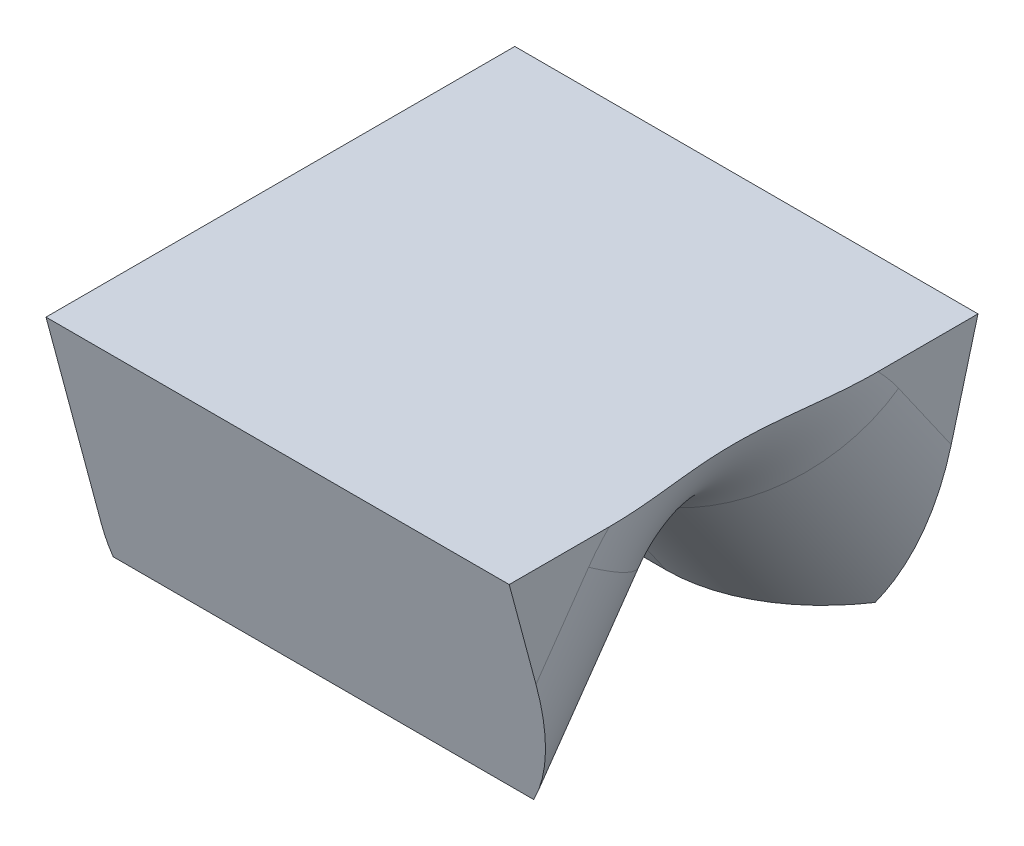
ISO-10303-21;
HEADER;
FILE_DESCRIPTION(('STEP AP214'),'2;1');
FILE_NAME('part.step','',(''),(''),'','','');
FILE_SCHEMA(('AUTOMOTIVE_DESIGN { 1 0 10303 214 1 1 1 1 }'));
ENDSEC;
DATA;
#1=APPLICATION_CONTEXT('core data for automotive mechanical design processes');
#2=APPLICATION_PROTOCOL_DEFINITION('international standard','automotive_design',2000,#1);
#3=PRODUCT_CONTEXT('',#1,'mechanical');
#4=PRODUCT('Part','Part','',(#3));
#5=PRODUCT_RELATED_PRODUCT_CATEGORY('part','',(#4));
#6=PRODUCT_DEFINITION_FORMATION('','',#4);
#7=PRODUCT_DEFINITION_CONTEXT('part definition',#1,'design');
#8=PRODUCT_DEFINITION('design','',#6,#7);
#9=PRODUCT_DEFINITION_SHAPE('','',#8);
#10=(LENGTH_UNIT() NAMED_UNIT(*) SI_UNIT(.MILLI.,.METRE.));
#11=(NAMED_UNIT(*) PLANE_ANGLE_UNIT() SI_UNIT($,.RADIAN.));
#12=(NAMED_UNIT(*) SI_UNIT($,.STERADIAN.) SOLID_ANGLE_UNIT());
#13=UNCERTAINTY_MEASURE_WITH_UNIT(LENGTH_MEASURE(1.E-05),#10,'distance_accuracy_value','');
#14=(GEOMETRIC_REPRESENTATION_CONTEXT(3) GLOBAL_UNCERTAINTY_ASSIGNED_CONTEXT((#13)) GLOBAL_UNIT_ASSIGNED_CONTEXT((#10,
#11,#12)) REPRESENTATION_CONTEXT('',''));
#15=CARTESIAN_POINT('',(0.,0.,0.));
#16=DIRECTION('',(0.,0.,1.));
#17=DIRECTION('',(1.,0.,0.));
#18=AXIS2_PLACEMENT_3D('',#15,#16,#17);
#19=CARTESIAN_POINT('',(0.,0.277595628415304,0.));
#20=DIRECTION('',(0.,1.,0.));
#21=DIRECTION('',(0.,0.,1.));
#22=AXIS2_PLACEMENT_3D('',#19,#20,#21);
#23=PLANE('',#22);
#24=DIRECTION('',(0.,0.,-1.));
#25=VECTOR('',#24,1.);
#26=CARTESIAN_POINT('',(-0.26924,0.277595628415304,1.50859998));
#27=LINE('',#26,#25);
#28=CARTESIAN_POINT('',(-0.269239999999999,0.277595628415304,0.273771524456291));
#29=VERTEX_POINT('',#28);
#30=CARTESIAN_POINT('',(-0.269239999999999,0.277595628415304,-0.273771524456291));
#31=VERTEX_POINT('',#30);
#32=EDGE_CURVE('E328',#29,#31,#27,.T.);
#33=ORIENTED_EDGE('',*,*,#32,.F.);
#34=DIRECTION('',(-1.,0.,0.));
#35=VECTOR('',#34,1.);
#36=CARTESIAN_POINT('',(1.50859998,0.277595628415304,0.273771524456291));
#37=LINE('',#36,#35);
#38=CARTESIAN_POINT('',(0.27178,0.277595628415304,0.273771524456291));
#39=VERTEX_POINT('',#38);
#40=EDGE_CURVE('E154',#39,#29,#37,.T.);
#41=ORIENTED_EDGE('',*,*,#40,.F.);
#42=DIRECTION('',(0.,0.,1.));
#43=VECTOR('',#42,1.);
#44=CARTESIAN_POINT('',(0.27178,0.277595628415304,1.50859998));
#45=LINE('',#44,#43);
#46=CARTESIAN_POINT('',(0.27178,0.277595628415304,0.156835133555911));
#47=VERTEX_POINT('',#46);
#48=EDGE_CURVE('E63',#47,#39,#45,.T.);
#49=ORIENTED_EDGE('',*,*,#48,.F.);
#50=CARTESIAN_POINT('',(0.260856065764861,0.277595628415304,0.));
#51=CARTESIAN_POINT('',(0.260859581723212,0.277595628415304,0.0133573572333045));
#52=CARTESIAN_POINT('',(0.261486636752462,0.277595628415304,0.026714564460264));
#53=CARTESIAN_POINT('',(0.263564215693477,0.277595628415304,0.0533773420007175));
#54=CARTESIAN_POINT('',(0.265016467960462,0.277595628415304,0.0666827447303772));
#55=CARTESIAN_POINT('',(0.267877387801581,0.277595628415304,0.0933045480556776));
#56=CARTESIAN_POINT('',(0.269286036769228,0.277595628415304,0.106620950923157));
#57=CARTESIAN_POINT('',(0.271284557554122,0.277595628415304,0.133300755183635));
#58=CARTESIAN_POINT('',(0.271876125746059,0.277595628415304,0.146664001281597));
#59=CARTESIAN_POINT('',(0.271650185577998,0.277595628415304,0.174352881249858));
#60=CARTESIAN_POINT('',(0.270729160155607,0.277595628415304,0.188679171880719));
#61=CARTESIAN_POINT('',(0.266773190056462,0.277595628415304,0.217049988659772));
#62=CARTESIAN_POINT('',(0.263739587941552,0.277595628415304,0.231094687933217));
#63=CARTESIAN_POINT('',(0.255219347439575,0.277595628415304,0.258619114772984));
#64=CARTESIAN_POINT('',(0.249704598402838,0.277595628415304,0.272090375012309));
#65=CARTESIAN_POINT('',(0.236138927454607,0.277595628415304,0.29770338378269));
#66=CARTESIAN_POINT('',(0.228089335107096,0.277595628415304,0.309845824810772));
#67=CARTESIAN_POINT('',(0.210834763642126,0.277595628415304,0.330712750197026));
#68=CARTESIAN_POINT('',(0.201918970562116,0.277595628415304,0.339676587957936));
#69=CARTESIAN_POINT('',(0.182543705320509,0.277595628415304,0.355744079806716));
#70=CARTESIAN_POINT('',(0.172085310358428,0.277595628415304,0.362849022435234));
#71=CARTESIAN_POINT('',(0.151235189983468,0.277595628415304,0.37419383571117));
#72=CARTESIAN_POINT('',(0.140969705379889,0.277595628415304,0.378666863124576));
#73=CARTESIAN_POINT('',(0.119811203993574,0.277595628415304,0.385729341936798));
#74=CARTESIAN_POINT('',(0.108918460966107,0.277595628415304,0.388319608407823));
#75=CARTESIAN_POINT('',(0.0873672233601213,0.277595628415304,0.391443006274816));
#76=CARTESIAN_POINT('',(0.0767218238760435,0.277595628415304,0.392067199115077));
#77=CARTESIAN_POINT('',(0.0554795294128855,0.277595628415304,0.391495039694482));
#78=CARTESIAN_POINT('',(0.0448826338463163,0.277595628415304,0.39029870954299));
#79=CARTESIAN_POINT('',(0.0241739993252354,0.277595628415304,0.386153317625145));
#80=CARTESIAN_POINT('',(0.014057904735605,0.277595628415304,0.383225927400932));
#81=CARTESIAN_POINT('',(-0.00554537216412168,0.277595628415304,0.375737330565397));
#82=CARTESIAN_POINT('',(-0.0150327410201281,0.277595628415304,0.371176611165897));
#83=CARTESIAN_POINT('',(-0.0332587998024882,0.277595628415304,0.360500672800452));
#84=CARTESIAN_POINT('',(-0.0419857056099512,0.277595628415304,0.354365373572935));
#85=CARTESIAN_POINT('',(-0.0583446093571725,0.277595628415304,0.340766624520734));
#86=CARTESIAN_POINT('',(-0.0659755283507225,0.277595628415304,0.333301881894461));
#87=CARTESIAN_POINT('',(-0.0802853842906157,0.277595628415304,0.316930985979422));
#88=CARTESIAN_POINT('',(-0.0869088422774418,0.277595628415304,0.307976439341334));
#89=CARTESIAN_POINT('',(-0.0986806404521546,0.277595628415304,0.289174582103424));
#90=CARTESIAN_POINT('',(-0.103831479314435,0.277595628415304,0.279328821510868));
#91=CARTESIAN_POINT('',(-0.113041341272987,0.277595628415304,0.258113385825763));
#92=CARTESIAN_POINT('',(-0.116966541384629,0.277595628415304,0.246685638348774));
#93=CARTESIAN_POINT('',(-0.121612471693822,0.277595628415304,0.229210331485362));
#94=CARTESIAN_POINT('',(-0.122955483126774,0.277595628415304,0.223318241614892));
#95=CARTESIAN_POINT('',(-0.125244886373686,0.277595628415304,0.211470727028606));
#96=CARTESIAN_POINT('',(-0.126192153740701,0.277595628415304,0.205515472338883));
#97=CARTESIAN_POINT('',(-0.128601922339676,0.277595628415304,0.186646550189418));
#98=CARTESIAN_POINT('',(-0.129394583532181,0.277595628415304,0.173645482962802));
#99=CARTESIAN_POINT('',(-0.129648706517757,0.277595628415304,0.147627773005509));
#100=CARTESIAN_POINT('',(-0.129107771661843,0.277595628415304,0.134611144313768));
#101=CARTESIAN_POINT('',(-0.127222813435294,0.277595628415304,0.108567764176989));
#102=CARTESIAN_POINT('',(-0.125873892971252,0.277595628415304,0.0955414387701875));
#103=CARTESIAN_POINT('',(-0.123084121643513,0.277595628415304,0.069512374545221));
#104=CARTESIAN_POINT('',(-0.121643351899568,0.277595628415304,0.0565096250652049));
#105=CARTESIAN_POINT('',(-0.119460296345347,0.277595628415304,0.0301767827468524));
#106=CARTESIAN_POINT('',(-0.118732102115061,0.277595628415304,0.0168452328671297));
#107=CARTESIAN_POINT('',(-0.118527223608265,0.277595628415304,-0.00982932926050958));
#108=CARTESIAN_POINT('',(-0.119050480159716,0.277595628415304,-0.023172340936661));
#109=CARTESIAN_POINT('',(-0.120979030248132,0.277595628415304,-0.0497668673555322));
#110=CARTESIAN_POINT('',(-0.122383578205092,0.277595628415304,-0.0630184498769468));
#111=CARTESIAN_POINT('',(-0.125229068611857,0.277595628415304,-0.0895196611906265));
#112=CARTESIAN_POINT('',(-0.126670016265645,0.277595628415304,-0.102769289428003));
#113=CARTESIAN_POINT('',(-0.128454207165341,0.277595628415304,-0.124892386517151));
#114=CARTESIAN_POINT('',(-0.129003410028066,0.277595628415304,-0.133746992245624));
#115=CARTESIAN_POINT('',(-0.129591819722376,0.277595628415304,-0.151467631104965));
#116=CARTESIAN_POINT('',(-0.129631503347371,0.277595628415304,-0.160333645786796));
#117=CARTESIAN_POINT('',(-0.129053060334447,0.277595628415304,-0.177970921843009));
#118=CARTESIAN_POINT('',(-0.128440649016523,0.277595628415304,-0.18674233692102));
#119=CARTESIAN_POINT('',(-0.126452835127563,0.277595628415304,-0.204201217873008));
#120=CARTESIAN_POINT('',(-0.125077280994916,0.277595628415304,-0.212888666722326));
#121=CARTESIAN_POINT('',(-0.120636733195247,0.277595628415304,-0.234090938450728));
#122=CARTESIAN_POINT('',(-0.117083839956292,0.277595628415304,-0.246509739036082));
#123=CARTESIAN_POINT('',(-0.107971877578375,0.277595628415304,-0.270678220537578));
#124=CARTESIAN_POINT('',(-0.102401716118858,0.277595628415304,-0.282423777604592));
#125=CARTESIAN_POINT('',(-0.0892200333763844,0.277595628415304,-0.304798235140745));
#126=CARTESIAN_POINT('',(-0.0815985849496846,0.277595628415304,-0.315421345873207));
#127=CARTESIAN_POINT('',(-0.064492590638324,0.277595628415304,-0.335005639016106));
#128=CARTESIAN_POINT('',(-0.0550132375646796,0.277595628415304,-0.343971321202508));
#129=CARTESIAN_POINT('',(-0.0355874235305449,0.277595628415304,-0.358995203585384));
#130=CARTESIAN_POINT('',(-0.025802815580199,0.277595628415304,-0.365263158339736));
#131=CARTESIAN_POINT('',(-0.00525519835325503,0.277595628415304,-0.375932551128299));
#132=CARTESIAN_POINT('',(0.0055080662577117,0.277595628415304,-0.380333500348691));
#133=CARTESIAN_POINT('',(0.0269053296924095,0.277595628415304,-0.386855613361861));
#134=CARTESIAN_POINT('',(0.0374985442837811,0.277595628415304,-0.389111206490908));
#135=CARTESIAN_POINT('',(0.0589124590207714,0.277595628415304,-0.391760537790259));
#136=CARTESIAN_POINT('',(0.0697330618700635,0.277595628415304,-0.392155056627043));
#137=CARTESIAN_POINT('',(0.0910065606862955,0.277595628415304,-0.391083332907498));
#138=CARTESIAN_POINT('',(0.101461847784476,0.277595628415304,-0.389663767915564));
#139=CARTESIAN_POINT('',(0.121986716267812,0.277595628415304,-0.385093066388629));
#140=CARTESIAN_POINT('',(0.132056282455157,0.277595628415304,-0.381941861700107));
#141=CARTESIAN_POINT('',(0.15155806603541,0.277595628415304,-0.374004788608507));
#142=CARTESIAN_POINT('',(0.160988565238266,0.277595628415304,-0.36921470777855));
#143=CARTESIAN_POINT('',(0.178939712426924,0.277595628415304,-0.358162163791041));
#144=CARTESIAN_POINT('',(0.187460394498652,0.277595628415304,-0.351899755821788));
#145=CARTESIAN_POINT('',(0.203628485348223,0.277595628415304,-0.337901287972741));
#146=CARTESIAN_POINT('',(0.211243358071232,0.277595628415304,-0.330127722154216));
#147=CARTESIAN_POINT('',(0.225154296991539,0.277595628415304,-0.313477933230045));
#148=CARTESIAN_POINT('',(0.231449698085481,0.277595628415304,-0.304601157605575));
#149=CARTESIAN_POINT('',(0.242999835240113,0.277595628415304,-0.285401795583443));
#150=CARTESIAN_POINT('',(0.248160417372384,0.277595628415304,-0.275022749599115));
#151=CARTESIAN_POINT('',(0.256877737156891,0.277595628415304,-0.253631953146645));
#152=CARTESIAN_POINT('',(0.260435741305191,0.277595628415304,-0.242620710082681));
#153=CARTESIAN_POINT('',(0.267444990374675,0.277595628415304,-0.21458797847913));
#154=CARTESIAN_POINT('',(0.269943232641209,0.277595628415304,-0.19732803733479));
#155=CARTESIAN_POINT('',(0.272178473447273,0.277595628415304,-0.162598992446642));
#156=CARTESIAN_POINT('',(0.271900534552631,0.277595628415304,-0.145129262905894));
#157=CARTESIAN_POINT('',(0.270154796576648,0.277595628415304,-0.11703218040305));
#158=CARTESIAN_POINT('',(0.269186599901579,0.277595628415304,-0.106361417430718));
#159=CARTESIAN_POINT('',(0.26701766108076,0.277595628415304,-0.0850350787463587));
#160=CARTESIAN_POINT('',(0.265816720445326,0.277595628415304,-0.0743795238737967));
#161=CARTESIAN_POINT('',(0.263623665173923,0.277595628415304,-0.0531157808921601));
#162=CARTESIAN_POINT('',(0.262630224338682,0.277595628415304,-0.04250774444444));
#163=CARTESIAN_POINT('',(0.26124560338014,0.277595628415304,-0.0212663815979182));
#164=CARTESIAN_POINT('',(0.260853266881203,0.277595628415304,-0.0106331432696083));
#165=CARTESIAN_POINT('',(0.260856065764861,0.277595628415304,0.));
#166=B_SPLINE_CURVE_WITH_KNOTS('',3,(#50,#51,#52,#53,#54,#55,#56,#57,#58,#59,#60,#61,#62,#63,
#64,#65,#66,#67,#68,#69,#70,#71,#72,#73,#74,#75,#76,#77,#78,#79,#80,#81,#82,#83,#84,#85,#86,#87,
#88,#89,#90,#91,#92,#93,#94,#95,#96,#97,#98,#99,#100,#101,#102,#103,#104,#105,#106,#107,#108,
#109,#110,#111,#112,#113,#114,#115,#116,#117,#118,#119,#120,#121,#122,#123,#124,#125,#126,#127,
#128,#129,#130,#131,#132,#133,#134,#135,#136,#137,#138,#139,#140,#141,#142,#143,#144,#145,#146,
#147,#148,#149,#150,#151,#152,#153,#154,#155,#156,#157,#158,#159,#160,#161,#162,#163,#164,#165),
.UNSPECIFIED.,.T.,.F.,(4,2,2,2,2,2,2,2,2,2,2,2,2,2,2,2,2,2,2,2,2,2,2,2,2,2,2,2,2,2,2,2,2,2,2,2,
2,2,2,2,2,2,2,2,2,2,2,2,2,2,2,2,2,2,2,2,2,4),(0.,0.0400667012763012,0.0802176322385874,
0.120385466682642,0.160469781055812,0.203413249220812,0.246329451293781,0.289744627455174,
0.333137069518122,0.370849205869476,0.408535131413483,0.441958755407641,0.475367901239217,
0.50720501192803,0.539041735973751,0.570488083988754,0.601925059558243,0.633784802903578,
0.665675698750745,0.698946501415674,0.732160512010009,0.768261606841802,0.78638029058175,
0.804458673091193,0.843431162986537,0.882473742653211,0.921755383108164,0.961002798826581,
1.00101154904342,1.04101840757381,1.08099146551355,1.12097027102341,1.14757452519485,
1.17415388205592,1.20050218561122,1.22685572386381,1.26544694824528,1.30425367813766,
1.34325169828868,1.38214223528141,1.41681964750779,1.45150613327586,1.48383901309019,
1.51615832899608,1.54766255008455,1.57916801119853,1.61075506729956,1.64234093958893,
1.67484384681284,1.70736309851601,1.74199457306809,1.77659863059832,1.82860003769383,
1.88088139202055,1.91302292764384,1.945191995938,1.97714870493006,2.00904385960551),.UNSPECIFIED.);
#167=CARTESIAN_POINT('',(0.271780000000016,0.277595628415304,-0.15683513355591));
#168=VERTEX_POINT('',#167);
#169=EDGE_CURVE('E12',#168,#47,#166,.T.);
#170=ORIENTED_EDGE('',*,*,#169,.F.);
#171=CARTESIAN_POINT('',(0.27178,0.277595628415304,-0.273771524456291));
#172=VERTEX_POINT('',#171);
#173=EDGE_CURVE('E141',#172,#168,#45,.T.);
#174=ORIENTED_EDGE('',*,*,#173,.F.);
#175=DIRECTION('',(1.,0.,0.));
#176=VECTOR('',#175,1.);
#177=CARTESIAN_POINT('',(1.50859998,0.277595628415304,-0.273771524456291));
#178=LINE('',#177,#176);
#179=EDGE_CURVE('E332',#31,#172,#178,.T.);
#180=ORIENTED_EDGE('',*,*,#179,.F.);
#181=EDGE_LOOP('',(#33,#41,#49,#170,#174,#180));
#182=FACE_BOUND('',#181,.T.);
#183=ADVANCED_FACE('F43',(#182),#23,.T.);
#184=CARTESIAN_POINT('',(1.50859998,0.,-0.19939));
#185=DIRECTION('',(0.,-0.258819045102522,-0.965925826289068));
#186=DIRECTION('',(0.,0.965925826289068,-0.258819045102522));
#187=AXIS2_PLACEMENT_3D('',#184,#185,#186);
#188=PLANE('',#187);
#189=DIRECTION('',(0.,0.965925826289068,-0.258819045102522));
#190=VECTOR('',#189,1.);
#191=CARTESIAN_POINT('',(-0.26924,0.,-0.19939));
#192=LINE('',#191,#190);
#193=CARTESIAN_POINT('',(-0.26924,0.035961265173748,-0.209025791962107));
#194=VERTEX_POINT('',#193);
#195=EDGE_CURVE('E317',#194,#31,#192,.T.);
#196=ORIENTED_EDGE('',*,*,#195,.T.);
#197=ORIENTED_EDGE('',*,*,#179,.T.);
#198=DIRECTION('',(0.,-0.965925826289068,0.258819045102522));
#199=VECTOR('',#198,1.);
#200=CARTESIAN_POINT('',(0.27178,0.,-0.19939));
#201=LINE('',#200,#199);
#202=CARTESIAN_POINT('',(0.27178,0.160868655615237,-0.242494626359583));
#203=VERTEX_POINT('',#202);
#204=EDGE_CURVE('E153',#172,#203,#201,.T.);
#205=ORIENTED_EDGE('',*,*,#204,.T.);
#206=CARTESIAN_POINT('',(0.0711199999999998,0.160868655615237,-0.242494626359583));
#207=DIRECTION('',(0.,-0.258819045102522,-0.965925826289068));
#208=DIRECTION('',(0.,-0.965925826289068,0.258819045102522));
#209=AXIS2_PLACEMENT_3D('',#206,#207,#208);
#210=ELLIPSE('',#209,0.261943026677416,0.20066);
#211=CARTESIAN_POINT('',(0.226000122767598,0.,-0.19939));
#212=VERTEX_POINT('',#211);
#213=EDGE_CURVE('E170',#203,#212,#210,.T.);
#214=ORIENTED_EDGE('',*,*,#213,.T.);
#215=DIRECTION('',(-1.,0.,0.));
#216=VECTOR('',#215,1.);
#217=CARTESIAN_POINT('',(1.50859998,0.,-0.19939));
#218=LINE('',#217,#216);
#219=CARTESIAN_POINT('',(-0.265155055093439,0.,-0.19939));
#220=VERTEX_POINT('',#219);
#221=EDGE_CURVE('E310',#212,#220,#218,.T.);
#222=ORIENTED_EDGE('',*,*,#221,.T.);
#223=CARTESIAN_POINT('',(-0.16764,0.035961265173748,-0.209025791962107));
#224=DIRECTION('',(0.,-0.258819045102522,-0.965925826289068));
#225=DIRECTION('',(0.,0.965925826289068,-0.258819045102522));
#226=AXIS2_PLACEMENT_3D('',#223,#224,#225);
#227=ELLIPSE('',#226,0.13262938059616,0.1016);
#228=EDGE_CURVE('E203',#220,#194,#227,.T.);
#229=ORIENTED_EDGE('',*,*,#228,.T.);
#230=EDGE_LOOP('',(#196,#197,#205,#214,#222,#229));
#231=FACE_BOUND('',#230,.T.);
#232=ADVANCED_FACE('F246',(#231),#188,.T.);
#233=CARTESIAN_POINT('',(1.50859998,0.,0.19939));
#234=DIRECTION('',(0.,-0.258819045102522,0.965925826289068));
#235=DIRECTION('',(0.,-0.965925826289068,-0.258819045102522));
#236=AXIS2_PLACEMENT_3D('',#233,#234,#235);
#237=PLANE('',#236);
#238=DIRECTION('',(0.,0.965925826289068,0.258819045102522));
#239=VECTOR('',#238,1.);
#240=CARTESIAN_POINT('',(0.27178,0.,0.19939));
#241=LINE('',#240,#239);
#242=CARTESIAN_POINT('',(0.27178,0.160868655615237,0.242494626359583));
#243=VERTEX_POINT('',#242);
#244=EDGE_CURVE('E293',#243,#39,#241,.T.);
#245=ORIENTED_EDGE('',*,*,#244,.T.);
#246=ORIENTED_EDGE('',*,*,#40,.T.);
#247=DIRECTION('',(0.,-0.965925826289068,-0.258819045102522));
#248=VECTOR('',#247,1.);
#249=CARTESIAN_POINT('',(-0.26924,0.,0.19939));
#250=LINE('',#249,#248);
#251=CARTESIAN_POINT('',(-0.26924,0.035961265173748,0.209025791962107));
#252=VERTEX_POINT('',#251);
#253=EDGE_CURVE('E229',#29,#252,#250,.T.);
#254=ORIENTED_EDGE('',*,*,#253,.T.);
#255=CARTESIAN_POINT('',(-0.16764,0.035961265173748,0.209025791962107));
#256=DIRECTION('',(0.,-0.258819045102522,0.965925826289068));
#257=DIRECTION('',(0.,-0.965925826289068,-0.258819045102522));
#258=AXIS2_PLACEMENT_3D('',#255,#256,#257);
#259=ELLIPSE('',#258,0.13262938059616,0.1016);
#260=CARTESIAN_POINT('',(-0.265155055093439,0.,0.19939));
#261=VERTEX_POINT('',#260);
#262=EDGE_CURVE('E70',#252,#261,#259,.T.);
#263=ORIENTED_EDGE('',*,*,#262,.T.);
#264=DIRECTION('',(-1.,0.,0.));
#265=VECTOR('',#264,1.);
#266=CARTESIAN_POINT('',(1.50859998,0.,0.19939));
#267=LINE('',#266,#265);
#268=CARTESIAN_POINT('',(0.226000122767598,0.,0.19939));
#269=VERTEX_POINT('',#268);
#270=EDGE_CURVE('E314',#269,#261,#267,.T.);
#271=ORIENTED_EDGE('',*,*,#270,.F.);
#272=CARTESIAN_POINT('',(0.0711199999999998,0.160868655615237,0.242494626359583));
#273=DIRECTION('',(0.,-0.258819045102522,0.965925826289068));
#274=DIRECTION('',(0.,0.965925826289068,0.258819045102522));
#275=AXIS2_PLACEMENT_3D('',#272,#273,#274);
#276=ELLIPSE('',#275,0.261943026677416,0.20066);
#277=EDGE_CURVE('E186',#269,#243,#276,.T.);
#278=ORIENTED_EDGE('',*,*,#277,.T.);
#279=EDGE_LOOP('',(#245,#246,#254,#263,#271,#278));
#280=FACE_BOUND('',#279,.T.);
#281=ADVANCED_FACE('F276',(#280),#237,.T.);
#282=CARTESIAN_POINT('',(-0.26924,0.82312002,1.50859998));
#283=DIRECTION('',(-1.,0.,0.));
#284=DIRECTION('',(0.,-1.,0.));
#285=AXIS2_PLACEMENT_3D('',#282,#283,#284);
#286=PLANE('',#285);
#287=ORIENTED_EDGE('',*,*,#253,.F.);
#288=ORIENTED_EDGE('',*,*,#32,.T.);
#289=ORIENTED_EDGE('',*,*,#195,.F.);
#290=DIRECTION('',(0.,-0.819152044288993,-0.573576436351044));
#291=VECTOR('',#290,1.);
#292=CARTESIAN_POINT('',(-0.26924,0.191850439119919,-0.0998710172397142));
#293=LINE('',#292,#291);
#294=CARTESIAN_POINT('',(-0.26924,0.191850439119919,-0.0998710172397141));
#295=VERTEX_POINT('',#294);
#296=EDGE_CURVE('E212',#194,#295,#293,.F.);
#297=ORIENTED_EDGE('',*,*,#296,.T.);
#298=CARTESIAN_POINT('',(-0.26924,0.12192,0.));
#299=DIRECTION('',(-1.,0.,0.));
#300=DIRECTION('',(0.,-1.,0.));
#301=AXIS2_PLACEMENT_3D('',#298,#299,#300);
#302=CIRCLE('',#301,0.12192);
#303=CARTESIAN_POINT('',(-0.26924,0.191850439119919,0.0998710172397141));
#304=VERTEX_POINT('',#303);
#305=EDGE_CURVE('E210',#295,#304,#302,.F.);
#306=ORIENTED_EDGE('',*,*,#305,.T.);
#307=DIRECTION('',(0.,0.819152044288994,-0.573576436351044));
#308=VECTOR('',#307,1.);
#309=CARTESIAN_POINT('',(-0.26924,0.058275365933266,0.193401290401922));
#310=LINE('',#309,#308);
#311=EDGE_CURVE('E207',#304,#252,#310,.F.);
#312=ORIENTED_EDGE('',*,*,#311,.T.);
#313=EDGE_LOOP('',(#287,#288,#289,#297,#306,#312));
#314=FACE_BOUND('',#313,.T.);
#315=ADVANCED_FACE('F362',(#314),#286,.T.);
#316=CARTESIAN_POINT('',(0.27178,-0.00999998,1.50859998));
#317=DIRECTION('',(1.,0.,0.));
#318=DIRECTION('',(0.,0.,-1.));
#319=AXIS2_PLACEMENT_3D('',#316,#317,#318);
#320=PLANE('',#319);
#321=ORIENTED_EDGE('',*,*,#204,.F.);
#322=ORIENTED_EDGE('',*,*,#173,.T.);
#323=CARTESIAN_POINT('',(0.27178,0.12192,0.));
#324=DIRECTION('',(1.,0.,0.));
#325=DIRECTION('',(0.,0.,-1.));
#326=AXIS2_PLACEMENT_3D('',#323,#324,#325);
#327=CIRCLE('',#326,0.22098);
#328=CARTESIAN_POINT('',(0.27178,0.248668920904854,-0.181016218746982));
#329=VERTEX_POINT('',#328);
#330=EDGE_CURVE('E151',#168,#329,#327,.F.);
#331=ORIENTED_EDGE('',*,*,#330,.T.);
#332=DIRECTION('',(0.,0.819152044288993,0.573576436351044));
#333=VECTOR('',#332,1.);
#334=CARTESIAN_POINT('',(0.27178,0.1150938477182,-0.27454649190919));
#335=LINE('',#334,#333);
#336=EDGE_CURVE('E164',#329,#203,#335,.F.);
#337=ORIENTED_EDGE('',*,*,#336,.T.);
#338=EDGE_LOOP('',(#321,#322,#331,#337));
#339=FACE_BOUND('',#338,.T.);
#340=ADVANCED_FACE('F149',(#339),#320,.T.);
#341=CARTESIAN_POINT('',(0.27178,0.248668920904854,0.181016218746982));
#342=VERTEX_POINT('',#341);
#343=EDGE_CURVE('E161',#342,#47,#327,.F.);
#344=ORIENTED_EDGE('',*,*,#343,.T.);
#345=ORIENTED_EDGE('',*,*,#48,.T.);
#346=ORIENTED_EDGE('',*,*,#244,.F.);
#347=DIRECTION('',(0.,-0.819152044288994,0.573576436351044));
#348=VECTOR('',#347,1.);
#349=CARTESIAN_POINT('',(0.27178,0.248668920904854,0.181016218746982));
#350=LINE('',#349,#348);
#351=EDGE_CURVE('E162',#243,#342,#350,.F.);
#352=ORIENTED_EDGE('',*,*,#351,.T.);
#353=EDGE_LOOP('',(#344,#345,#346,#352));
#354=FACE_BOUND('',#353,.T.);
#355=ADVANCED_FACE('F256',(#354),#320,.T.);
#356=CARTESIAN_POINT('',(0.0711199999999998,0.12192,0.));
#357=DIRECTION('',(1.,0.,0.));
#358=DIRECTION('',(0.,0.,-1.));
#359=AXIS2_PLACEMENT_3D('',#356,#357,#358);
#360=TOROIDAL_SURFACE('',#359,0.22098,0.20066);
#361=ORIENTED_EDGE('',*,*,#330,.F.);
#362=ORIENTED_EDGE('',*,*,#169,.T.);
#363=ORIENTED_EDGE('',*,*,#343,.F.);
#364=CARTESIAN_POINT('',(0.0711199999999999,0.248668920904854,0.181016218746982));
#365=DIRECTION('',(0.,0.819152044288993,-0.573576436351045));
#366=DIRECTION('',(0.,0.573576436351045,0.819152044288993));
#367=AXIS2_PLACEMENT_3D('',#364,#365,#366);
#368=CIRCLE('',#367,0.20066);
#369=CARTESIAN_POINT('',(0.0711199999999998,0.133575073186653,0.0166451695399524));
#370=VERTEX_POINT('',#369);
#371=EDGE_CURVE('E192',#342,#370,#368,.T.);
#372=ORIENTED_EDGE('',*,*,#371,.T.);
#373=CARTESIAN_POINT('',(0.0711199999999998,0.12192,0.));
#374=DIRECTION('',(1.,0.,0.));
#375=DIRECTION('',(0.,0.,-1.));
#376=AXIS2_PLACEMENT_3D('',#373,#374,#375);
#377=CIRCLE('',#376,0.0203200000000001);
#378=CARTESIAN_POINT('',(0.0711199999999998,0.133575073186653,-0.0166451695399524));
#379=VERTEX_POINT('',#378);
#380=EDGE_CURVE('E174',#379,#370,#377,.T.);
#381=ORIENTED_EDGE('',*,*,#380,.F.);
#382=CARTESIAN_POINT('',(0.0711199999999999,0.248668920904854,-0.181016218746982));
#383=DIRECTION('',(0.,-0.819152044288993,-0.573576436351044));
#384=DIRECTION('',(0.,0.573576436351044,-0.819152044288993));
#385=AXIS2_PLACEMENT_3D('',#382,#383,#384);
#386=CIRCLE('',#385,0.20066);
#387=EDGE_CURVE('E160',#329,#379,#386,.T.);
#388=ORIENTED_EDGE('',*,*,#387,.F.);
#389=EDGE_LOOP('',(#361,#362,#363,#372,#381,#388));
#390=FACE_BOUND('',#389,.T.);
#391=ADVANCED_FACE('F157',(#390),#360,.T.);
#392=CARTESIAN_POINT('',(0.,0.,0.));
#393=DIRECTION('',(0.,1.,0.));
#394=DIRECTION('',(0.,0.,1.));
#395=AXIS2_PLACEMENT_3D('',#392,#393,#394);
#396=PLANE('',#395);
#397=CARTESIAN_POINT('',(0.0711199999999999,0.,-0.11017544270216));
#398=DIRECTION('',(-1.,0.,0.));
#399=VECTOR('',#398,1.);
#400=LINE('',#397,#399);
#401=CARTESIAN_POINT('',(0.0711199999999998,0.,-0.11017544270216));
#402=VERTEX_POINT('',#401);
#403=CARTESIAN_POINT('',(-0.16764,0.,-0.11017544270216));
#404=VERTEX_POINT('',#403);
#405=EDGE_CURVE('E305',#402,#404,#400,.T.);
#406=ORIENTED_EDGE('',*,*,#405,.T.);
#407=CARTESIAN_POINT('',(-0.16764,0.,-0.234206140920324));
#408=DIRECTION('',(0.,1.,0.));
#409=DIRECTION('',(0.,0.,1.));
#410=AXIS2_PLACEMENT_3D('',#407,#408,#409);
#411=ELLIPSE('',#410,0.124030698218164,0.1016);
#412=EDGE_CURVE('E199',#404,#220,#411,.F.);
#413=ORIENTED_EDGE('',*,*,#412,.T.);
#414=ORIENTED_EDGE('',*,*,#221,.F.);
#415=CARTESIAN_POINT('',(0.0711199999999998,0.,-0.355136071683033));
#416=DIRECTION('',(0.,1.,0.));
#417=DIRECTION('',(0.,0.,-1.));
#418=AXIS2_PLACEMENT_3D('',#415,#416,#417);
#419=ELLIPSE('',#418,0.244960628980873,0.20066);
#420=EDGE_CURVE('E172',#212,#402,#419,.F.);
#421=ORIENTED_EDGE('',*,*,#420,.T.);
#422=EDGE_LOOP('',(#406,#413,#414,#421));
#423=FACE_BOUND('',#422,.T.);
#424=ADVANCED_FACE('F245',(#423),#396,.F.);
#425=ORIENTED_EDGE('',*,*,#270,.T.);
#426=CARTESIAN_POINT('',(-0.16764,0.,0.234206140920324));
#427=DIRECTION('',(0.,1.,0.));
#428=DIRECTION('',(0.,0.,1.));
#429=AXIS2_PLACEMENT_3D('',#426,#427,#428);
#430=ELLIPSE('',#429,0.124030698218164,0.1016);
#431=CARTESIAN_POINT('',(-0.16764,0.,0.11017544270216));
#432=VERTEX_POINT('',#431);
#433=EDGE_CURVE('E56',#261,#432,#430,.F.);
#434=ORIENTED_EDGE('',*,*,#433,.T.);
#435=CARTESIAN_POINT('',(-0.16764,0.,0.11017544270216));
#436=DIRECTION('',(1.,0.,0.));
#437=VECTOR('',#436,1.);
#438=LINE('',#435,#437);
#439=CARTESIAN_POINT('',(0.0711199999999996,0.,0.11017544270216));
#440=VERTEX_POINT('',#439);
#441=EDGE_CURVE('E221',#432,#440,#438,.T.);
#442=ORIENTED_EDGE('',*,*,#441,.T.);
#443=CARTESIAN_POINT('',(0.0711199999999998,0.,0.355136071683033));
#444=DIRECTION('',(0.,1.,0.));
#445=DIRECTION('',(0.,0.,-1.));
#446=AXIS2_PLACEMENT_3D('',#443,#444,#445);
#447=ELLIPSE('',#446,0.244960628980873,0.20066);
#448=EDGE_CURVE('E182',#440,#269,#447,.F.);
#449=ORIENTED_EDGE('',*,*,#448,.T.);
#450=EDGE_LOOP('',(#425,#434,#442,#449));
#451=FACE_BOUND('',#450,.T.);
#452=ADVANCED_FACE('F234',(#451),#396,.F.);
#453=CARTESIAN_POINT('',(-1.20142,0.133575073186653,-0.0166451695399524));
#454=DIRECTION('',(0.,0.573576436351044,-0.819152044288993));
#455=DIRECTION('',(0.,0.819152044288993,0.573576436351044));
#456=AXIS2_PLACEMENT_3D('',#453,#454,#455);
#457=PLANE('',#456);
#458=DIRECTION('',(1.,0.,0.));
#459=VECTOR('',#458,1.);
#460=CARTESIAN_POINT('',(-1.20142,0.133575073186653,-0.0166451695399524));
#461=LINE('',#460,#459);
#462=CARTESIAN_POINT('',(-0.16764,0.133575073186653,-0.0166451695399524));
#463=VERTEX_POINT('',#462);
#464=EDGE_CURVE('E196',#463,#379,#461,.T.);
#465=ORIENTED_EDGE('',*,*,#464,.F.);
#466=DIRECTION('',(0.,-0.819152044288993,-0.573576436351044));
#467=VECTOR('',#466,1.);
#468=CARTESIAN_POINT('',(-0.16764,0.,-0.11017544270216));
#469=LINE('',#468,#467);
#470=EDGE_CURVE('E190',#463,#404,#469,.T.);
#471=ORIENTED_EDGE('',*,*,#470,.T.);
#472=ORIENTED_EDGE('',*,*,#405,.F.);
#473=DIRECTION('',(0.,0.819152044288993,0.573576436351044));
#474=VECTOR('',#473,1.);
#475=CARTESIAN_POINT('',(0.0711199999999998,0.133575073186653,-0.0166451695399524));
#476=LINE('',#475,#474);
#477=EDGE_CURVE('E165',#402,#379,#476,.T.);
#478=ORIENTED_EDGE('',*,*,#477,.T.);
#479=EDGE_LOOP('',(#465,#471,#472,#478));
#480=FACE_BOUND('',#479,.T.);
#481=ADVANCED_FACE('F244',(#480),#457,.F.);
#482=CARTESIAN_POINT('',(-1.20142,-0.00999998000000012,0.117177504080106));
#483=DIRECTION('',(0.,0.573576436351044,0.819152044288994));
#484=DIRECTION('',(0.,-0.819152044288994,0.573576436351044));
#485=AXIS2_PLACEMENT_3D('',#482,#483,#484);
#486=PLANE('',#485);
#487=ORIENTED_EDGE('',*,*,#441,.F.);
#488=DIRECTION('',(0.,0.819152044288994,-0.573576436351044));
#489=VECTOR('',#488,1.);
#490=CARTESIAN_POINT('',(-0.16764,0.133575073186653,0.0166451695399524));
#491=LINE('',#490,#489);
#492=CARTESIAN_POINT('',(-0.16764,0.133575073186653,0.0166451695399524));
#493=VERTEX_POINT('',#492);
#494=EDGE_CURVE('E216',#432,#493,#491,.T.);
#495=ORIENTED_EDGE('',*,*,#494,.T.);
#496=DIRECTION('',(1.,0.,0.));
#497=VECTOR('',#496,1.);
#498=CARTESIAN_POINT('',(-1.20142,0.133575073186653,0.0166451695399524));
#499=LINE('',#498,#497);
#500=EDGE_CURVE('E322',#493,#370,#499,.T.);
#501=ORIENTED_EDGE('',*,*,#500,.T.);
#502=DIRECTION('',(0.,-0.819152044288994,0.573576436351044));
#503=VECTOR('',#502,1.);
#504=CARTESIAN_POINT('',(0.0711199999999998,0.,0.11017544270216));
#505=LINE('',#504,#503);
#506=EDGE_CURVE('E179',#370,#440,#505,.T.);
#507=ORIENTED_EDGE('',*,*,#506,.T.);
#508=EDGE_LOOP('',(#487,#495,#501,#507));
#509=FACE_BOUND('',#508,.T.);
#510=ADVANCED_FACE('F283',(#509),#486,.F.);
#511=CARTESIAN_POINT('',(-1.20142,0.12192,0.));
#512=DIRECTION('',(1.,0.,0.));
#513=DIRECTION('',(0.,0.,-1.));
#514=AXIS2_PLACEMENT_3D('',#511,#512,#513);
#515=CYLINDRICAL_SURFACE('',#514,0.0203200000000001);
#516=ORIENTED_EDGE('',*,*,#500,.F.);
#517=CARTESIAN_POINT('',(-0.16764,0.12192,0.));
#518=DIRECTION('',(-1.,0.,0.));
#519=DIRECTION('',(0.,-1.,0.));
#520=AXIS2_PLACEMENT_3D('',#517,#518,#519);
#521=CIRCLE('',#520,0.0203200000000001);
#522=EDGE_CURVE('E214',#493,#463,#521,.T.);
#523=ORIENTED_EDGE('',*,*,#522,.T.);
#524=ORIENTED_EDGE('',*,*,#464,.T.);
#525=ORIENTED_EDGE('',*,*,#380,.T.);
#526=EDGE_LOOP('',(#516,#523,#524,#525));
#527=FACE_BOUND('',#526,.T.);
#528=ADVANCED_FACE('F259',(#527),#515,.F.);
#529=CARTESIAN_POINT('',(0.0711199999999998,0.1050938677182,0.281548553287136));
#530=DIRECTION('',(0.,0.819152044288994,-0.573576436351044));
#531=DIRECTION('',(0.,0.573576436351044,0.819152044288994));
#532=AXIS2_PLACEMENT_3D('',#529,#530,#531);
#533=CYLINDRICAL_SURFACE('',#532,0.20066);
#534=ORIENTED_EDGE('',*,*,#448,.F.);
#535=ORIENTED_EDGE('',*,*,#506,.F.);
#536=ORIENTED_EDGE('',*,*,#371,.F.);
#537=ORIENTED_EDGE('',*,*,#351,.F.);
#538=ORIENTED_EDGE('',*,*,#277,.F.);
#539=EDGE_LOOP('',(#534,#535,#536,#537,#538));
#540=FACE_BOUND('',#539,.T.);
#541=ADVANCED_FACE('F251',(#540),#533,.T.);
#542=CARTESIAN_POINT('',(0.0711199999999998,0.248668920904854,-0.181016218746982));
#543=DIRECTION('',(0.,-0.819152044288993,-0.573576436351044));
#544=DIRECTION('',(0.,0.573576436351044,-0.819152044288993));
#545=AXIS2_PLACEMENT_3D('',#542,#543,#544);
#546=CYLINDRICAL_SURFACE('',#545,0.20066);
#547=ORIENTED_EDGE('',*,*,#213,.F.);
#548=ORIENTED_EDGE('',*,*,#336,.F.);
#549=ORIENTED_EDGE('',*,*,#387,.T.);
#550=ORIENTED_EDGE('',*,*,#477,.F.);
#551=ORIENTED_EDGE('',*,*,#420,.F.);
#552=EDGE_LOOP('',(#547,#548,#549,#550,#551));
#553=FACE_BOUND('',#552,.T.);
#554=ADVANCED_FACE('F248',(#553),#546,.T.);
#555=CARTESIAN_POINT('',(-0.16764,0.048275385933266,0.200403351779868));
#556=DIRECTION('',(0.,-0.819152044288994,0.573576436351044));
#557=DIRECTION('',(0.,-0.573576436351044,-0.819152044288994));
#558=AXIS2_PLACEMENT_3D('',#555,#556,#557);
#559=CYLINDRICAL_SURFACE('',#558,0.1016);
#560=ORIENTED_EDGE('',*,*,#262,.F.);
#561=ORIENTED_EDGE('',*,*,#311,.F.);
#562=CARTESIAN_POINT('',(-0.16764,0.191850439119919,0.0998710172397142));
#563=DIRECTION('',(0.,0.819152044288994,-0.573576436351043));
#564=DIRECTION('',(0.,0.573576436351043,0.819152044288994));
#565=AXIS2_PLACEMENT_3D('',#562,#563,#564);
#566=CIRCLE('',#565,0.1016);
#567=EDGE_CURVE('E193',#493,#304,#566,.T.);
#568=ORIENTED_EDGE('',*,*,#567,.F.);
#569=ORIENTED_EDGE('',*,*,#494,.F.);
#570=ORIENTED_EDGE('',*,*,#433,.F.);
#571=EDGE_LOOP('',(#560,#561,#568,#569,#570));
#572=FACE_BOUND('',#571,.T.);
#573=ADVANCED_FACE('F45',(#572),#559,.T.);
#574=CARTESIAN_POINT('',(-0.16764,0.12192,0.));
#575=DIRECTION('',(-1.,0.,0.));
#576=DIRECTION('',(0.,-1.,0.));
#577=AXIS2_PLACEMENT_3D('',#574,#575,#576);
#578=TOROIDAL_SURFACE('',#577,0.12192,0.1016);
#579=ORIENTED_EDGE('',*,*,#567,.T.);
#580=ORIENTED_EDGE('',*,*,#305,.F.);
#581=CARTESIAN_POINT('',(-0.16764,0.191850439119919,-0.0998710172397141));
#582=DIRECTION('',(0.,-0.819152044288993,-0.573576436351045));
#583=DIRECTION('',(0.,0.573576436351045,-0.819152044288993));
#584=AXIS2_PLACEMENT_3D('',#581,#582,#583);
#585=CIRCLE('',#584,0.1016);
#586=EDGE_CURVE('E331',#463,#295,#585,.T.);
#587=ORIENTED_EDGE('',*,*,#586,.F.);
#588=ORIENTED_EDGE('',*,*,#522,.F.);
#589=EDGE_LOOP('',(#579,#580,#587,#588));
#590=FACE_BOUND('',#589,.T.);
#591=ADVANCED_FACE('F263',(#590),#578,.T.);
#592=CARTESIAN_POINT('',(-0.16764,0.191850439119919,-0.0998710172397141));
#593=DIRECTION('',(0.,0.819152044288993,0.573576436351044));
#594=DIRECTION('',(0.,-0.573576436351044,0.819152044288993));
#595=AXIS2_PLACEMENT_3D('',#592,#593,#594);
#596=CYLINDRICAL_SURFACE('',#595,0.1016);
#597=ORIENTED_EDGE('',*,*,#586,.T.);
#598=ORIENTED_EDGE('',*,*,#296,.F.);
#599=ORIENTED_EDGE('',*,*,#228,.F.);
#600=ORIENTED_EDGE('',*,*,#412,.F.);
#601=ORIENTED_EDGE('',*,*,#470,.F.);
#602=EDGE_LOOP('',(#597,#598,#599,#600,#601));
#603=FACE_BOUND('',#602,.T.);
#604=ADVANCED_FACE('F261',(#603),#596,.T.);
#605=CLOSED_SHELL('',(#183,#232,#281,#315,#340,#355,#391,#424,#452,#481,#510,#528,#541,#554,
#573,#591,#604));
#606=MANIFOLD_SOLID_BREP('B2',#605);
#607=ADVANCED_BREP_SHAPE_REPRESENTATION('',(#18,#606),#14);
#608=SHAPE_DEFINITION_REPRESENTATION(#9,#607);
ENDSEC;
END-ISO-10303-21;
